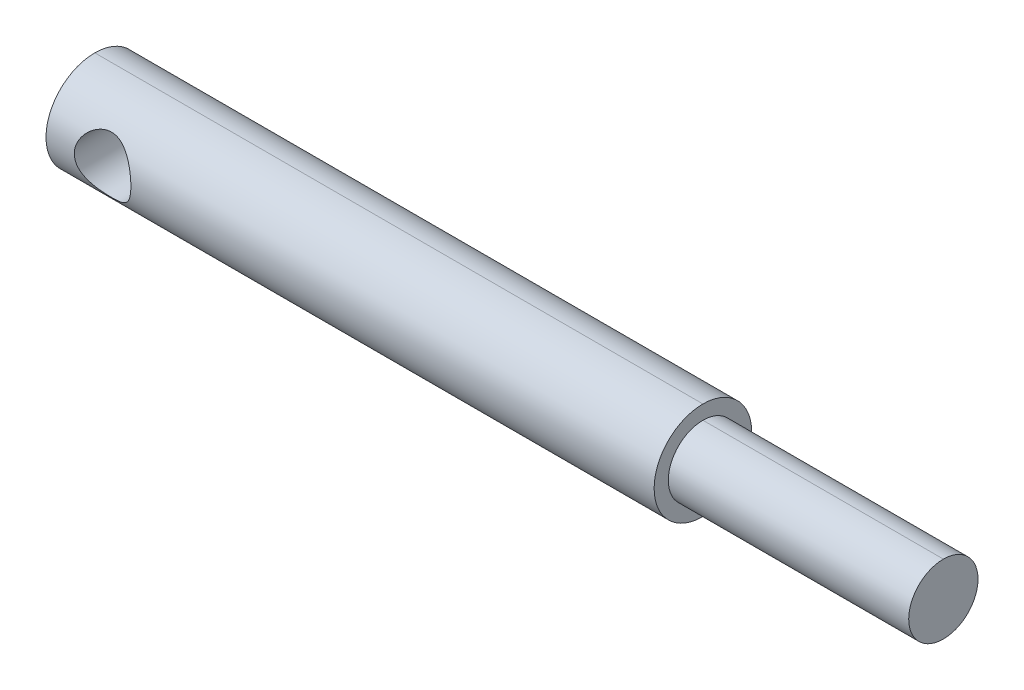
ISO-10303-21;
HEADER;
FILE_DESCRIPTION(('STEP AP214'),'2;1');
FILE_NAME('part.step','',(''),(''),'','','');
FILE_SCHEMA(('AUTOMOTIVE_DESIGN { 1 0 10303 214 1 1 1 1 }'));
ENDSEC;
DATA;
#1=APPLICATION_CONTEXT('core data for automotive mechanical design processes');
#2=APPLICATION_PROTOCOL_DEFINITION('international standard','automotive_design',2000,#1);
#3=PRODUCT_CONTEXT('',#1,'mechanical');
#4=PRODUCT('Part','Part','',(#3));
#5=PRODUCT_RELATED_PRODUCT_CATEGORY('part','',(#4));
#6=PRODUCT_DEFINITION_FORMATION('','',#4);
#7=PRODUCT_DEFINITION_CONTEXT('part definition',#1,'design');
#8=PRODUCT_DEFINITION('design','',#6,#7);
#9=PRODUCT_DEFINITION_SHAPE('','',#8);
#10=(LENGTH_UNIT() NAMED_UNIT(*) SI_UNIT(.MILLI.,.METRE.));
#11=(NAMED_UNIT(*) PLANE_ANGLE_UNIT() SI_UNIT($,.RADIAN.));
#12=(NAMED_UNIT(*) SI_UNIT($,.STERADIAN.) SOLID_ANGLE_UNIT());
#13=UNCERTAINTY_MEASURE_WITH_UNIT(LENGTH_MEASURE(1.E-05),#10,'distance_accuracy_value','');
#14=(GEOMETRIC_REPRESENTATION_CONTEXT(3) GLOBAL_UNCERTAINTY_ASSIGNED_CONTEXT((#13)) GLOBAL_UNIT_ASSIGNED_CONTEXT((#10,
#11,#12)) REPRESENTATION_CONTEXT('',''));
#15=CARTESIAN_POINT('',(0.,0.,0.));
#16=DIRECTION('',(0.,0.,1.));
#17=DIRECTION('',(1.,0.,0.));
#18=AXIS2_PLACEMENT_3D('',#15,#16,#17);
#19=CARTESIAN_POINT('',(-246.,48.0172,-6.9828));
#20=DIRECTION('',(1.,0.,0.));
#21=DIRECTION('',(0.,1.,0.));
#22=AXIS2_PLACEMENT_3D('',#19,#20,#21);
#23=PLANE('',#22);
#24=CARTESIAN_POINT('',(-246.,55.,0.));
#25=DIRECTION('',(1.,0.,0.));
#26=DIRECTION('',(0.,0.,-1.));
#27=AXIS2_PLACEMENT_3D('',#24,#25,#26);
#28=CIRCLE('',#27,6.9);
#29=CARTESIAN_POINT('',(-246.,61.9,-6.19576247374946E-10));
#30=VERTEX_POINT('',#29);
#31=CARTESIAN_POINT('',(-246.,48.1,-2.83042710229488E-09));
#32=VERTEX_POINT('',#31);
#33=EDGE_CURVE('E79',#30,#32,#28,.F.);
#34=ORIENTED_EDGE('',*,*,#33,.T.);
#35=CARTESIAN_POINT('',(-246.,55.,0.));
#36=DIRECTION('',(1.,0.,0.));
#37=DIRECTION('',(0.,0.,-1.));
#38=AXIS2_PLACEMENT_3D('',#35,#36,#37);
#39=CIRCLE('',#38,6.9);
#40=EDGE_CURVE('E83',#32,#30,#39,.F.);
#41=ORIENTED_EDGE('',*,*,#40,.T.);
#42=EDGE_LOOP('',(#34,#41));
#43=FACE_BOUND('',#42,.T.);
#44=ADVANCED_FACE('F37',(#43),#23,.F.);
#45=CARTESIAN_POINT('',(-246.,55.,0.));
#46=DIRECTION('',(1.,0.,0.));
#47=DIRECTION('',(0.,0.,-1.));
#48=AXIS2_PLACEMENT_3D('',#45,#46,#47);
#49=CYLINDRICAL_SURFACE('',#48,6.9);
#50=CARTESIAN_POINT('',(-234.,55.,-6.90000000000002));
#51=CARTESIAN_POINT('',(-234.000000942,55.1029536288844,-6.89999914839552));
#52=CARTESIAN_POINT('',(-234.003981034853,55.2059322242868,-6.89768975844328));
#53=CARTESIAN_POINT('',(-234.019851200322,55.4111154222154,-6.88850812982801));
#54=CARTESIAN_POINT('',(-234.031745802817,55.5133195475717,-6.88163327812111));
#55=CARTESIAN_POINT('',(-234.063319805975,55.716319541919,-6.8634744967275));
#56=CARTESIAN_POINT('',(-234.083013430049,55.8171124875998,-6.85218251178742));
#57=CARTESIAN_POINT('',(-234.129928142686,56.0163871896755,-6.82547368200222));
#58=CARTESIAN_POINT('',(-234.157152430937,56.1148679443097,-6.81005508390015));
#59=CARTESIAN_POINT('',(-234.249351812955,56.4048279371312,-6.75830854994906));
#60=CARTESIAN_POINT('',(-234.325045165759,56.5920284525817,-6.71637576686517));
#61=CARTESIAN_POINT('',(-234.502031712092,56.9504528580012,-6.6211962051335));
#62=CARTESIAN_POINT('',(-234.603319055007,57.1216803870562,-6.56795201264018));
#63=CARTESIAN_POINT('',(-234.836966314139,57.4576592996939,-6.45010475676878));
#64=CARTESIAN_POINT('',(-234.971062589895,57.6210102495167,-6.38495451922411));
#65=CARTESIAN_POINT('',(-235.262658901597,57.9242609179878,-6.25189508335624));
#66=CARTESIAN_POINT('',(-235.420186906035,58.0641321803091,-6.18398265940603));
#67=CARTESIAN_POINT('',(-235.775139302993,58.3324040075773,-6.04404159667066));
#68=CARTESIAN_POINT('',(-235.975058935565,58.4577379570365,-5.97241093908057));
#69=CARTESIAN_POINT('',(-236.397316018688,58.6725030708249,-5.84281917287821));
#70=CARTESIAN_POINT('',(-236.619618140437,58.7619897388585,-5.7848369896771));
#71=CARTESIAN_POINT('',(-237.028696722573,58.8847457538736,-5.70288612516936));
#72=CARTESIAN_POINT('',(-237.212076383101,58.9261667316484,-5.67418342412753));
#73=CARTESIAN_POINT('',(-237.584643370847,58.9828228902868,-5.63456907302353));
#74=CARTESIAN_POINT('',(-237.773823953676,58.9980873882806,-5.62363750513743));
#75=CARTESIAN_POINT('',(-238.152849946906,59.0015765660484,-5.62115580674796));
#76=CARTESIAN_POINT('',(-238.342695930947,58.9897600537668,-5.6296352016148));
#77=CARTESIAN_POINT('',(-238.717187908294,58.9397195203391,-5.66475958615738));
#78=CARTESIAN_POINT('',(-238.901830128713,58.901476827271,-5.69141741998042));
#79=CARTESIAN_POINT('',(-239.260211973159,58.800832878816,-5.75910335413198));
#80=CARTESIAN_POINT('',(-239.434012569322,58.7385842329928,-5.80004052455388));
#81=CARTESIAN_POINT('',(-239.769220065924,58.5921251950927,-5.89186690350671));
#82=CARTESIAN_POINT('',(-239.930622249345,58.5079064974776,-5.94275987389536));
#83=CARTESIAN_POINT('',(-240.264658755625,58.3038846819312,-6.05889860781819));
#84=CARTESIAN_POINT('',(-240.434771603899,58.1805066091613,-6.12512813914487));
#85=CARTESIAN_POINT('',(-240.753530884978,57.9089529261583,-6.25867106539734));
#86=CARTESIAN_POINT('',(-240.902158121521,57.7607553930648,-6.32598537056661));
#87=CARTESIAN_POINT('',(-241.191932220882,57.4221660573646,-6.46376529275755));
#88=CARTESIAN_POINT('',(-241.330003460099,57.2288393200851,-6.53362834863297));
#89=CARTESIAN_POINT('',(-241.510782947786,56.9205849572708,-6.62819704738604));
#90=CARTESIAN_POINT('',(-241.566672234688,56.8147427342391,-6.65802567264316));
#91=CARTESIAN_POINT('',(-241.669076193693,56.5975797465904,-6.71343854527004));
#92=CARTESIAN_POINT('',(-241.71559658179,56.4862623742812,-6.73902537887519));
#93=CARTESIAN_POINT('',(-241.795848674175,56.2666007570005,-6.78361504495154));
#94=CARTESIAN_POINT('',(-241.830229849532,56.1585596847939,-6.80294484849764));
#95=CARTESIAN_POINT('',(-241.889814899116,55.9392746957978,-6.83666991595849));
#96=CARTESIAN_POINT('',(-241.915023773708,55.8280325599008,-6.85106786826652));
#97=CARTESIAN_POINT('',(-241.955886901675,55.6033182545936,-6.87450078608837));
#98=CARTESIAN_POINT('',(-241.97154702455,55.4898474994599,-6.883539046045));
#99=CARTESIAN_POINT('',(-241.993075293742,55.2616785001133,-6.89598230534247));
#100=CARTESIAN_POINT('',(-241.998944611858,55.146980404447,-6.89938797881134));
#101=CARTESIAN_POINT('',(-242.000679135529,54.9319303751649,-6.90039387984801));
#102=CARTESIAN_POINT('',(-241.997709862738,54.831588677972,-6.89867047171825));
#103=CARTESIAN_POINT('',(-241.984255892736,54.6315475783894,-6.890882723416));
#104=CARTESIAN_POINT('',(-241.973768854018,54.5318483858804,-6.88481703078244));
#105=CARTESIAN_POINT('',(-241.945414009406,54.3338929219313,-6.86849010701833));
#106=CARTESIAN_POINT('',(-241.927549131626,54.2356360940489,-6.85823054036661));
#107=CARTESIAN_POINT('',(-241.884662838683,54.041185405747,-6.83376185934328));
#108=CARTESIAN_POINT('',(-241.859638663568,53.9449923563306,-6.81955122186869));
#109=CARTESIAN_POINT('',(-241.775046349208,53.6632000139136,-6.77191120791538));
#110=CARTESIAN_POINT('',(-241.705513280331,53.4813671335462,-6.73320893427633));
#111=CARTESIAN_POINT('',(-241.542283370893,53.1319761449468,-6.64477881834878));
#112=CARTESIAN_POINT('',(-241.448581037632,52.9644212930656,-6.59504847018426));
#113=CARTESIAN_POINT('',(-241.228669290004,52.6293650336917,-6.48262639660693));
#114=CARTESIAN_POINT('',(-241.100088918878,52.4636914260089,-6.41912382896325));
#115=CARTESIAN_POINT('',(-240.819495501819,52.1549964247524,-6.28841250784309));
#116=CARTESIAN_POINT('',(-240.667455310109,52.0120016670022,-6.22119951958277));
#117=CARTESIAN_POINT('',(-240.323346365742,51.7355990009974,-6.08114935540518));
#118=CARTESIAN_POINT('',(-240.128675096979,51.6052746039048,-6.00857525991375));
#119=CARTESIAN_POINT('',(-239.716470645783,51.3793954249137,-5.8752433713933));
#120=CARTESIAN_POINT('',(-239.498966849391,51.2837966406212,-5.81447067007642));
#121=CARTESIAN_POINT('',(-239.094694373196,51.1481415848604,-5.72523500459477));
#122=CARTESIAN_POINT('',(-238.911369191471,51.1005633168091,-5.69263491752893));
#123=CARTESIAN_POINT('',(-238.537703238466,51.0317693473189,-5.64490496370246));
#124=CARTESIAN_POINT('',(-238.347371253769,51.0105217136939,-5.62975393736555));
#125=CARTESIAN_POINT('',(-237.964584047158,50.9955628451676,-5.61912671837378));
#126=CARTESIAN_POINT('',(-237.772124748863,51.0019195956018,-5.62369910124569));
#127=CARTESIAN_POINT('',(-237.391455060976,51.0419254714152,-5.65192055505162));
#128=CARTESIAN_POINT('',(-237.203247377753,51.0755915038541,-5.6755814435483));
#129=CARTESIAN_POINT('',(-236.84082651009,51.1671941779042,-5.73781556117307));
#130=CARTESIAN_POINT('',(-236.666378539985,51.224488201203,-5.77599200724094));
#131=CARTESIAN_POINT('',(-236.329229119682,51.3610916126706,-5.86301024053716));
#132=CARTESIAN_POINT('',(-236.166531919987,51.4404089173694,-5.91185586157767));
#133=CARTESIAN_POINT('',(-235.830631301496,51.63297076917,-6.02389611072438));
#134=CARTESIAN_POINT('',(-235.65969853437,51.7495661686314,-6.08814150855858));
#135=CARTESIAN_POINT('',(-235.33816570143,52.0071464001863,-6.218822463421));
#136=CARTESIAN_POINT('',(-235.18758437203,52.1481534379755,-6.28525996954092));
#137=CARTESIAN_POINT('',(-234.890171778652,52.4733916154831,-6.42350426962497));
#138=CARTESIAN_POINT('',(-234.746617524081,52.6608911635525,-6.49481761167484));
#139=CARTESIAN_POINT('',(-234.556738534402,52.9608818538888,-6.59265829020997));
#140=CARTESIAN_POINT('',(-234.497672615859,53.0640387229619,-6.62375887744165));
#141=CARTESIAN_POINT('',(-234.38858056947,53.2760970350402,-6.68208171038616));
#142=CARTESIAN_POINT('',(-234.338551971385,53.3849968977242,-6.70930501547333));
#143=CARTESIAN_POINT('',(-234.256251860355,53.5878713710952,-6.75460538221487));
#144=CARTESIAN_POINT('',(-234.222404729747,53.6810407339668,-6.7734476618689));
#145=CARTESIAN_POINT('',(-234.161578337695,53.8702277403034,-6.80755796796639));
#146=CARTESIAN_POINT('',(-234.134597852976,53.9662448730384,-6.82282663100073));
#147=CARTESIAN_POINT('',(-234.08785660692,54.1603129935459,-6.84941585720421));
#148=CARTESIAN_POINT('',(-234.068078971887,54.2583586517562,-6.86074564487991));
#149=CARTESIAN_POINT('',(-234.035900672223,54.45600432826,-6.8792375233041));
#150=CARTESIAN_POINT('',(-234.023496158353,54.5556035075948,-6.8864017886776));
#151=CARTESIAN_POINT('',(-234.009908473817,54.7128235881477,-6.89425964918163));
#152=CARTESIAN_POINT('',(-234.006194890549,54.7701672075494,-6.89641030464119));
#153=CARTESIAN_POINT('',(-234.001240219262,54.885004608781,-6.8992808170072));
#154=CARTESIAN_POINT('',(-233.999999473875,54.942498410315,-6.90000047563758));
#155=CARTESIAN_POINT('',(-234.,55.,-6.90000000000002));
#156=B_SPLINE_CURVE_WITH_KNOTS('',3,(#50,#51,#52,#53,#54,#55,#56,#57,#58,#59,#60,#61,#62,#63,
#64,#65,#66,#67,#68,#69,#70,#71,#72,#73,#74,#75,#76,#77,#78,#79,#80,#81,#82,#83,#84,#85,#86,#87,
#88,#89,#90,#91,#92,#93,#94,#95,#96,#97,#98,#99,#100,#101,#102,#103,#104,#105,#106,#107,#108,
#109,#110,#111,#112,#113,#114,#115,#116,#117,#118,#119,#120,#121,#122,#123,#124,#125,#126,#127,
#128,#129,#130,#131,#132,#133,#134,#135,#136,#137,#138,#139,#140,#141,#142,#143,#144,#145,#146,
#147,#148,#149,#150,#151,#152,#153,#154,#155),.UNSPECIFIED.,.T.,.F.,(4,2,2,2,2,2,2,2,2,2,2,2,2,
2,2,2,2,2,2,2,2,2,2,2,2,2,2,2,2,2,2,2,2,2,2,2,2,2,2,2,2,2,2,2,2,2,2,2,2,2,2,2,4),(0.,
0.308801505943557,0.617779907056976,0.927324419754942,1.23700065669204,1.85272790205075,
2.4683145234346,3.12913553952934,3.79075174759474,4.52689089348619,5.26188580040118,
5.82996811715995,6.39741328917538,6.96572215657589,7.53443298458417,8.09958649150563,
8.66495395893332,9.32334568088451,9.98232205297717,10.7209503072913,11.0905649430417,
11.4599533879635,11.804510442746,12.1488793765873,12.4930364171305,12.83715226475,
13.1379827773055,13.4389070282321,13.7397119631083,14.0406330167937,14.633393088582,
15.2262879897145,15.8810130511836,16.5365014680592,17.2687489228065,18.000065249957,
18.5741784430503,19.1475947031766,19.7224239988877,20.2976094408088,20.8580872328548,
21.4187667567069,22.0662154850114,22.7142562802561,23.450167154913,23.8183609191438,
24.1864538894725,24.488848248594,24.7911886992326,25.0928162479883,25.3942861893487,
25.5667339007828,25.7392055045647),.UNSPECIFIED.);
#157=CARTESIAN_POINT('',(-234.,55.,-6.90000000000002));
#158=VERTEX_POINT('',#157);
#159=EDGE_CURVE('E86',#158,#158,#156,.T.);
#160=ORIENTED_EDGE('',*,*,#159,.T.);
#161=EDGE_LOOP('',(#160));
#162=FACE_BOUND('',#161,.T.);
#163=ORIENTED_EDGE('',*,*,#33,.F.);
#164=DIRECTION('',(-1.,0.,0.));
#165=VECTOR('',#164,1.);
#166=CARTESIAN_POINT('',(-203.,61.9,0.));
#167=LINE('',#166,#165);
#168=CARTESIAN_POINT('',(-160.,61.9,0.));
#169=VERTEX_POINT('',#168);
#170=EDGE_CURVE('E85',#30,#169,#167,.F.);
#171=ORIENTED_EDGE('',*,*,#170,.T.);
#172=CARTESIAN_POINT('',(-160.,55.,-1.72969529198847E-13));
#173=DIRECTION('',(1.,0.,0.));
#174=DIRECTION('',(0.,0.,-1.));
#175=AXIS2_PLACEMENT_3D('',#172,#173,#174);
#176=CIRCLE('',#175,6.9);
#177=CARTESIAN_POINT('',(-160.,48.1,-2.83042778902414E-09));
#178=VERTEX_POINT('',#177);
#179=EDGE_CURVE('E91',#169,#178,#176,.F.);
#180=ORIENTED_EDGE('',*,*,#179,.T.);
#181=DIRECTION('',(1.,0.,0.));
#182=VECTOR('',#181,1.);
#183=CARTESIAN_POINT('',(-203.,48.1,-2.83042731353948E-09));
#184=LINE('',#183,#182);
#185=EDGE_CURVE('E88',#178,#32,#184,.F.);
#186=ORIENTED_EDGE('',*,*,#185,.T.);
#187=EDGE_LOOP('',(#163,#171,#180,#186));
#188=FACE_BOUND('',#187,.T.);
#189=ADVANCED_FACE('F89',(#162,#188),#49,.T.);
#190=CARTESIAN_POINT('',(-246.,55.,0.));
#191=DIRECTION('',(1.,0.,0.));
#192=DIRECTION('',(0.,0.,-1.));
#193=AXIS2_PLACEMENT_3D('',#190,#191,#192);
#194=CYLINDRICAL_SURFACE('',#193,6.9);
#195=CARTESIAN_POINT('',(-234.,55.,6.89999999999999));
#196=CARTESIAN_POINT('',(-234.000000942,54.8970463711156,6.89999914839549));
#197=CARTESIAN_POINT('',(-234.003981034853,54.7940677757132,6.89768975844324));
#198=CARTESIAN_POINT('',(-234.019851200322,54.5888845777846,6.88850812982796));
#199=CARTESIAN_POINT('',(-234.031745802817,54.4866804524282,6.88163327812106));
#200=CARTESIAN_POINT('',(-234.063319805975,54.283680458081,6.86347449672745));
#201=CARTESIAN_POINT('',(-234.083013430049,54.1828875124002,6.85218251178737));
#202=CARTESIAN_POINT('',(-234.129928142686,53.9836128103245,6.82547368200217));
#203=CARTESIAN_POINT('',(-234.157152430937,53.8851320556902,6.8100550839001));
#204=CARTESIAN_POINT('',(-234.249351812955,53.5951720628688,6.75830854994901));
#205=CARTESIAN_POINT('',(-234.325045165759,53.4079715474183,6.71637576686512));
#206=CARTESIAN_POINT('',(-234.502031712092,53.0495471419988,6.62119620513344));
#207=CARTESIAN_POINT('',(-234.603319055007,52.8783196129438,6.56795201264012));
#208=CARTESIAN_POINT('',(-234.836966314139,52.5423407003061,6.45010475676873));
#209=CARTESIAN_POINT('',(-234.971062589895,52.3789897504833,6.38495451922407));
#210=CARTESIAN_POINT('',(-235.262658901597,52.0757390820122,6.2518950833562));
#211=CARTESIAN_POINT('',(-235.420186906035,51.9358678196909,6.18398265940598));
#212=CARTESIAN_POINT('',(-235.775139302993,51.6675959924227,6.04404159667062));
#213=CARTESIAN_POINT('',(-235.975058935565,51.5422620429636,5.97241093908053));
#214=CARTESIAN_POINT('',(-236.397316018688,51.3274969291751,5.84281917287816));
#215=CARTESIAN_POINT('',(-236.619618140437,51.2380102611414,5.78483698967705));
#216=CARTESIAN_POINT('',(-237.028696722573,51.1152542461264,5.7028861251693));
#217=CARTESIAN_POINT('',(-237.212076383101,51.0738332683516,5.67418342412747));
#218=CARTESIAN_POINT('',(-237.584643370847,51.0171771097132,5.63456907302348));
#219=CARTESIAN_POINT('',(-237.773823953676,51.0019126117194,5.62363750513738));
#220=CARTESIAN_POINT('',(-238.152849946906,50.9984234339516,5.6211558067479));
#221=CARTESIAN_POINT('',(-238.342695930947,51.0102399462332,5.62963520161475));
#222=CARTESIAN_POINT('',(-238.717187908294,51.0602804796609,5.66475958615733));
#223=CARTESIAN_POINT('',(-238.901830128713,51.098523172729,5.69141741998037));
#224=CARTESIAN_POINT('',(-239.260211973159,51.199167121184,5.75910335413193));
#225=CARTESIAN_POINT('',(-239.434012569322,51.2614157670072,5.80004052455383));
#226=CARTESIAN_POINT('',(-239.769220065924,51.4078748049073,5.89186690350667));
#227=CARTESIAN_POINT('',(-239.930622249345,51.4920935025224,5.94275987389532));
#228=CARTESIAN_POINT('',(-240.264658755625,51.6961153180687,6.05889860781815));
#229=CARTESIAN_POINT('',(-240.434771603899,51.8194933908387,6.12512813914482));
#230=CARTESIAN_POINT('',(-240.753530884978,52.0910470738416,6.2586710653973));
#231=CARTESIAN_POINT('',(-240.902158121521,52.2392446069352,6.32598537056657));
#232=CARTESIAN_POINT('',(-241.191932220882,52.5778339426354,6.46376529275752));
#233=CARTESIAN_POINT('',(-241.330003460099,52.7711606799148,6.53362834863294));
#234=CARTESIAN_POINT('',(-241.510782947786,53.0794150427291,6.62819704738601));
#235=CARTESIAN_POINT('',(-241.566672234688,53.1852572657609,6.65802567264313));
#236=CARTESIAN_POINT('',(-241.669076193693,53.4024202534095,6.71343854527));
#237=CARTESIAN_POINT('',(-241.71559658179,53.5137376257187,6.73902537887516));
#238=CARTESIAN_POINT('',(-241.795848674175,53.7333992429995,6.78361504495151));
#239=CARTESIAN_POINT('',(-241.830229849532,53.8414403152061,6.80294484849761));
#240=CARTESIAN_POINT('',(-241.889814899116,54.0607253042021,6.83666991595846));
#241=CARTESIAN_POINT('',(-241.915023773708,54.1719674400991,6.8510678682665));
#242=CARTESIAN_POINT('',(-241.955886901675,54.3966817454064,6.87450078608836));
#243=CARTESIAN_POINT('',(-241.97154702455,54.5101525005401,6.88353904604499));
#244=CARTESIAN_POINT('',(-241.993075293742,54.7383214998866,6.89598230534245));
#245=CARTESIAN_POINT('',(-241.998944611858,54.8530195955529,6.89938797881133));
#246=CARTESIAN_POINT('',(-242.000679135529,55.068069624835,6.900393879848));
#247=CARTESIAN_POINT('',(-241.997709862738,55.168411322028,6.89867047171823));
#248=CARTESIAN_POINT('',(-241.984255892736,55.3684524216106,6.89088272341599));
#249=CARTESIAN_POINT('',(-241.973768854018,55.4681516141196,6.88481703078243));
#250=CARTESIAN_POINT('',(-241.945414009406,55.6661070780686,6.86849010701832));
#251=CARTESIAN_POINT('',(-241.927549131626,55.7643639059511,6.85823054036659));
#252=CARTESIAN_POINT('',(-241.884662838683,55.9588145942529,6.83376185934326));
#253=CARTESIAN_POINT('',(-241.859638663568,56.0550076436694,6.81955122186868));
#254=CARTESIAN_POINT('',(-241.775046349208,56.3367999860863,6.77191120791537));
#255=CARTESIAN_POINT('',(-241.705513280331,56.5186328664538,6.73320893427632));
#256=CARTESIAN_POINT('',(-241.542283370893,56.8680238550532,6.64477881834878));
#257=CARTESIAN_POINT('',(-241.448581037632,57.0355787069344,6.59504847018425));
#258=CARTESIAN_POINT('',(-241.228669290004,57.3706349663082,6.48262639660693));
#259=CARTESIAN_POINT('',(-241.100088918878,57.5363085739911,6.41912382896324));
#260=CARTESIAN_POINT('',(-240.819495501819,57.8450035752476,6.28841250784308));
#261=CARTESIAN_POINT('',(-240.667455310109,57.9879983329978,6.22119951958276));
#262=CARTESIAN_POINT('',(-240.323346365742,58.2644009990026,6.08114935540518));
#263=CARTESIAN_POINT('',(-240.128675096979,58.3947253960952,6.00857525991374));
#264=CARTESIAN_POINT('',(-239.716470645783,58.6206045750862,5.87524337139329));
#265=CARTESIAN_POINT('',(-239.498966849391,58.7162033593788,5.81447067007642));
#266=CARTESIAN_POINT('',(-239.094694373196,58.8518584151396,5.72523500459476));
#267=CARTESIAN_POINT('',(-238.911369191471,58.8994366831908,5.69263491752892));
#268=CARTESIAN_POINT('',(-238.537703238466,58.9682306526811,5.64490496370245));
#269=CARTESIAN_POINT('',(-238.347371253769,58.9894782863061,5.62975393736554));
#270=CARTESIAN_POINT('',(-237.964584047158,59.0044371548323,5.61912671837377));
#271=CARTESIAN_POINT('',(-237.772124748863,58.9980804043982,5.62369910124568));
#272=CARTESIAN_POINT('',(-237.391455060976,58.9580745285848,5.6519205550516));
#273=CARTESIAN_POINT('',(-237.203247377753,58.9244084961459,5.67558144354828));
#274=CARTESIAN_POINT('',(-236.84082651009,58.8328058220958,5.73781556117306));
#275=CARTESIAN_POINT('',(-236.666378539985,58.775511798797,5.77599200724093));
#276=CARTESIAN_POINT('',(-236.329229119682,58.6389083873294,5.86301024053714));
#277=CARTESIAN_POINT('',(-236.166531919987,58.5595910826306,5.91185586157765));
#278=CARTESIAN_POINT('',(-235.830631301496,58.36702923083,6.02389611072436));
#279=CARTESIAN_POINT('',(-235.65969853437,58.2504338313686,6.08814150855856));
#280=CARTESIAN_POINT('',(-235.33816570143,57.9928535998136,6.21882246342097));
#281=CARTESIAN_POINT('',(-235.18758437203,57.8518465620245,6.2852599695409));
#282=CARTESIAN_POINT('',(-234.890171778652,57.5266083845169,6.42350426962494));
#283=CARTESIAN_POINT('',(-234.746617524081,57.3391088364475,6.49481761167481));
#284=CARTESIAN_POINT('',(-234.556738534402,57.0391181461112,6.59265829020994));
#285=CARTESIAN_POINT('',(-234.497672615859,56.935961277038,6.62375887744162));
#286=CARTESIAN_POINT('',(-234.38858056947,56.7239029649597,6.68208171038612));
#287=CARTESIAN_POINT('',(-234.338551971385,56.6150031022757,6.70930501547329));
#288=CARTESIAN_POINT('',(-234.256251860355,56.4121286289047,6.75460538221483));
#289=CARTESIAN_POINT('',(-234.222404729747,56.3189592660332,6.77344766186885));
#290=CARTESIAN_POINT('',(-234.161578337695,56.1297722596966,6.80755796796635));
#291=CARTESIAN_POINT('',(-234.134597852976,56.0337551269615,6.82282663100069));
#292=CARTESIAN_POINT('',(-234.08785660692,55.839687006454,6.84941585720417));
#293=CARTESIAN_POINT('',(-234.068078971887,55.7416413482437,6.86074564487986));
#294=CARTESIAN_POINT('',(-234.035900672223,55.54399567174,6.87923752330406));
#295=CARTESIAN_POINT('',(-234.023496158353,55.4443964924052,6.88640178867756));
#296=CARTESIAN_POINT('',(-234.009908473817,55.2871764118523,6.89425964918158));
#297=CARTESIAN_POINT('',(-234.006194890549,55.2298327924506,6.89641030464114));
#298=CARTESIAN_POINT('',(-234.001240219262,55.114995391219,6.89928081700716));
#299=CARTESIAN_POINT('',(-233.999999473875,55.057501589685,6.90000047563755));
#300=CARTESIAN_POINT('',(-234.,55.,6.89999999999999));
#301=B_SPLINE_CURVE_WITH_KNOTS('',3,(#195,#196,#197,#198,#199,#200,#201,#202,#203,#204,#205,
#206,#207,#208,#209,#210,#211,#212,#213,#214,#215,#216,#217,#218,#219,#220,#221,#222,#223,#224,
#225,#226,#227,#228,#229,#230,#231,#232,#233,#234,#235,#236,#237,#238,#239,#240,#241,#242,#243,
#244,#245,#246,#247,#248,#249,#250,#251,#252,#253,#254,#255,#256,#257,#258,#259,#260,#261,#262,
#263,#264,#265,#266,#267,#268,#269,#270,#271,#272,#273,#274,#275,#276,#277,#278,#279,#280,#281,
#282,#283,#284,#285,#286,#287,#288,#289,#290,#291,#292,#293,#294,#295,#296,#297,#298,#299,#300),
.UNSPECIFIED.,.T.,.F.,(4,2,2,2,2,2,2,2,2,2,2,2,2,2,2,2,2,2,2,2,2,2,2,2,2,2,2,2,2,2,2,2,2,2,2,2,
2,2,2,2,2,2,2,2,2,2,2,2,2,2,2,2,4),(0.,0.308801505943564,0.617779907056977,0.927324419754942,
1.23700065669204,1.85272790205076,2.46831452343462,3.12913553952931,3.79075174759476,
4.52689089348612,5.26188580040119,5.82996811715997,6.3974132891754,6.9657221565759,
7.53443298458416,8.09958649150565,8.66495395893334,9.32334568088449,9.98232205297717,
10.7209503072913,11.0905649430417,11.4599533879635,11.8045104427459,12.1488793765873,
12.4930364171305,12.83715226475,13.1379827773055,13.4389070282321,13.7397119631083,
14.0406330167937,14.633393088582,15.2262879897145,15.8810130511836,16.5365014680592,
17.2687489228065,18.000065249957,18.5741784430503,19.1475947031767,19.7224239988878,
20.2976094408088,20.8580872328549,21.4187667567069,22.0662154850114,22.7142562802561,
23.450167154913,23.8183609191438,24.1864538894725,24.488848248594,24.7911886992327,
25.0928162479883,25.3942861893488,25.5667339007828,25.7392055045647),.UNSPECIFIED.);
#302=CARTESIAN_POINT('',(-234.,55.,6.89999999999999));
#303=VERTEX_POINT('',#302);
#304=EDGE_CURVE('E11',#303,#303,#301,.T.);
#305=ORIENTED_EDGE('',*,*,#304,.T.);
#306=EDGE_LOOP('',(#305));
#307=FACE_BOUND('',#306,.T.);
#308=ORIENTED_EDGE('',*,*,#185,.F.);
#309=CARTESIAN_POINT('',(-160.,55.,-1.72969529198847E-13));
#310=DIRECTION('',(1.,0.,0.));
#311=DIRECTION('',(0.,0.,-1.));
#312=AXIS2_PLACEMENT_3D('',#309,#310,#311);
#313=CIRCLE('',#312,6.9);
#314=EDGE_CURVE('E102',#178,#169,#313,.F.);
#315=ORIENTED_EDGE('',*,*,#314,.T.);
#316=ORIENTED_EDGE('',*,*,#170,.F.);
#317=ORIENTED_EDGE('',*,*,#40,.F.);
#318=EDGE_LOOP('',(#308,#315,#316,#317));
#319=FACE_BOUND('',#318,.T.);
#320=ADVANCED_FACE('F96',(#307,#319),#194,.T.);
#321=CARTESIAN_POINT('',(-126.,59.9588,-4.9588));
#322=DIRECTION('',(-1.,0.,0.));
#323=DIRECTION('',(0.,-1.,0.));
#324=AXIS2_PLACEMENT_3D('',#321,#322,#323);
#325=PLANE('',#324);
#326=CARTESIAN_POINT('',(-126.,55.,0.));
#327=DIRECTION('',(1.,0.,0.));
#328=DIRECTION('',(0.,0.,-1.));
#329=AXIS2_PLACEMENT_3D('',#326,#327,#328);
#330=CIRCLE('',#329,4.9);
#331=CARTESIAN_POINT('',(-126.,50.1,-2.01001372406605E-09));
#332=VERTEX_POINT('',#331);
#333=CARTESIAN_POINT('',(-126.,59.9,-4.39989203905519E-10));
#334=VERTEX_POINT('',#333);
#335=EDGE_CURVE('E97',#332,#334,#330,.T.);
#336=ORIENTED_EDGE('',*,*,#335,.T.);
#337=CARTESIAN_POINT('',(-126.,55.,0.));
#338=DIRECTION('',(1.,0.,0.));
#339=DIRECTION('',(0.,0.,-1.));
#340=AXIS2_PLACEMENT_3D('',#337,#338,#339);
#341=CIRCLE('',#340,4.9);
#342=EDGE_CURVE('E107',#334,#332,#341,.T.);
#343=ORIENTED_EDGE('',*,*,#342,.T.);
#344=EDGE_LOOP('',(#336,#343));
#345=FACE_BOUND('',#344,.T.);
#346=ADVANCED_FACE('F134',(#345),#325,.F.);
#347=CARTESIAN_POINT('',(-160.,55.,0.));
#348=DIRECTION('',(1.,0.,0.));
#349=DIRECTION('',(0.,0.,-1.));
#350=AXIS2_PLACEMENT_3D('',#347,#348,#349);
#351=CYLINDRICAL_SURFACE('',#350,4.9);
#352=CARTESIAN_POINT('',(-160.,55.,0.));
#353=DIRECTION('',(1.,0.,0.));
#354=DIRECTION('',(0.,0.,-1.));
#355=AXIS2_PLACEMENT_3D('',#352,#353,#354);
#356=CIRCLE('',#355,4.9);
#357=CARTESIAN_POINT('',(-160.,50.1,-2.01001344945579E-09));
#358=VERTEX_POINT('',#357);
#359=CARTESIAN_POINT('',(-160.,59.9,-4.39988929295252E-10));
#360=VERTEX_POINT('',#359);
#361=EDGE_CURVE('E104',#358,#360,#356,.T.);
#362=ORIENTED_EDGE('',*,*,#361,.T.);
#363=DIRECTION('',(-1.,0.,0.));
#364=VECTOR('',#363,1.);
#365=CARTESIAN_POINT('',(-143.,59.9,0.));
#366=LINE('',#365,#364);
#367=EDGE_CURVE('E106',#360,#334,#366,.F.);
#368=ORIENTED_EDGE('',*,*,#367,.T.);
#369=ORIENTED_EDGE('',*,*,#335,.F.);
#370=DIRECTION('',(1.,0.,0.));
#371=VECTOR('',#370,1.);
#372=CARTESIAN_POINT('',(-143.,50.1,-2.01001359947006E-09));
#373=LINE('',#372,#371);
#374=EDGE_CURVE('E59',#332,#358,#373,.F.);
#375=ORIENTED_EDGE('',*,*,#374,.T.);
#376=EDGE_LOOP('',(#362,#368,#369,#375));
#377=FACE_BOUND('',#376,.T.);
#378=ADVANCED_FACE('F132',(#377),#351,.T.);
#379=CARTESIAN_POINT('',(-160.,61.9828,-6.9828));
#380=DIRECTION('',(-1.,0.,0.));
#381=DIRECTION('',(0.,-1.,0.));
#382=AXIS2_PLACEMENT_3D('',#379,#380,#381);
#383=PLANE('',#382);
#384=ORIENTED_EDGE('',*,*,#361,.F.);
#385=CARTESIAN_POINT('',(-160.,55.,0.));
#386=DIRECTION('',(1.,0.,0.));
#387=DIRECTION('',(0.,0.,-1.));
#388=AXIS2_PLACEMENT_3D('',#385,#386,#387);
#389=CIRCLE('',#388,4.9);
#390=EDGE_CURVE('E51',#358,#360,#389,.F.);
#391=ORIENTED_EDGE('',*,*,#390,.T.);
#392=EDGE_LOOP('',(#384,#391));
#393=FACE_BOUND('',#392,.T.);
#394=ORIENTED_EDGE('',*,*,#179,.F.);
#395=ORIENTED_EDGE('',*,*,#314,.F.);
#396=EDGE_LOOP('',(#394,#395));
#397=FACE_BOUND('',#396,.T.);
#398=ADVANCED_FACE('F39',(#393,#397),#383,.F.);
#399=CARTESIAN_POINT('',(-160.,55.,0.));
#400=DIRECTION('',(1.,0.,0.));
#401=DIRECTION('',(0.,0.,-1.));
#402=AXIS2_PLACEMENT_3D('',#399,#400,#401);
#403=CYLINDRICAL_SURFACE('',#402,4.9);
#404=ORIENTED_EDGE('',*,*,#374,.F.);
#405=ORIENTED_EDGE('',*,*,#342,.F.);
#406=ORIENTED_EDGE('',*,*,#367,.F.);
#407=ORIENTED_EDGE('',*,*,#390,.F.);
#408=EDGE_LOOP('',(#404,#405,#406,#407));
#409=FACE_BOUND('',#408,.T.);
#410=ADVANCED_FACE('F126',(#409),#403,.T.);
#411=CARTESIAN_POINT('',(-238.,55.,-6.90000000000017));
#412=DIRECTION('',(0.,0.,1.));
#413=DIRECTION('',(1.,0.,0.));
#414=AXIS2_PLACEMENT_3D('',#411,#412,#413);
#415=CYLINDRICAL_SURFACE('',#414,3.99999999999999);
#416=ORIENTED_EDGE('',*,*,#304,.F.);
#417=EDGE_LOOP('',(#416));
#418=FACE_BOUND('',#417,.T.);
#419=ORIENTED_EDGE('',*,*,#159,.F.);
#420=EDGE_LOOP('',(#419));
#421=FACE_BOUND('',#420,.T.);
#422=ADVANCED_FACE('F122',(#418,#421),#415,.F.);
#423=CLOSED_SHELL('',(#44,#189,#320,#346,#378,#398,#410,#422));
#424=MANIFOLD_SOLID_BREP('B2',#423);
#425=ADVANCED_BREP_SHAPE_REPRESENTATION('',(#18,#424),#14);
#426=SHAPE_DEFINITION_REPRESENTATION(#9,#425);
ENDSEC;
END-ISO-10303-21;
